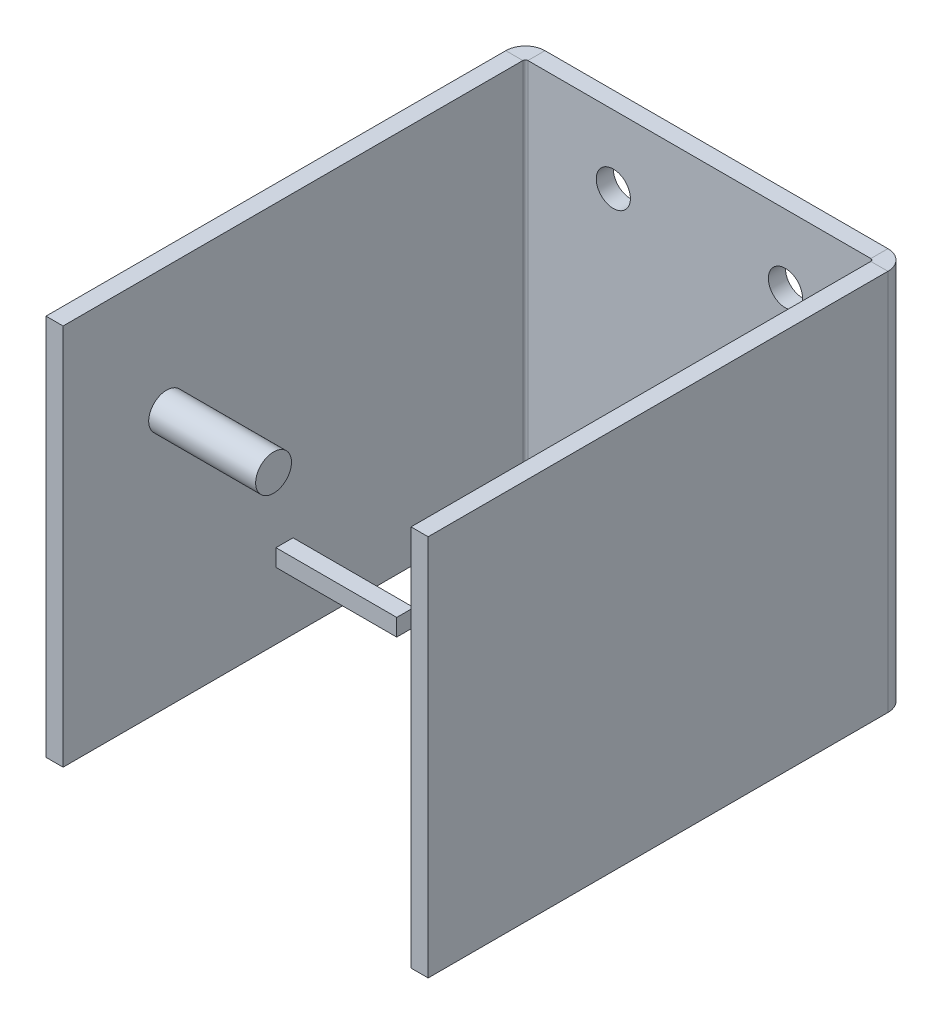
ISO-10303-21;
HEADER;
FILE_DESCRIPTION(('STEP AP214'),'2;1');
FILE_NAME('part.step','',(''),(''),'','','');
FILE_SCHEMA(('AUTOMOTIVE_DESIGN { 1 0 10303 214 1 1 1 1 }'));
ENDSEC;
DATA;
#1=APPLICATION_CONTEXT('core data for automotive mechanical design processes');
#2=APPLICATION_PROTOCOL_DEFINITION('international standard','automotive_design',2000,#1);
#3=PRODUCT_CONTEXT('',#1,'mechanical');
#4=PRODUCT('Part','Part','',(#3));
#5=PRODUCT_RELATED_PRODUCT_CATEGORY('part','',(#4));
#6=PRODUCT_DEFINITION_FORMATION('','',#4);
#7=PRODUCT_DEFINITION_CONTEXT('part definition',#1,'design');
#8=PRODUCT_DEFINITION('design','',#6,#7);
#9=PRODUCT_DEFINITION_SHAPE('','',#8);
#10=(LENGTH_UNIT() NAMED_UNIT(*) SI_UNIT(.MILLI.,.METRE.));
#11=(NAMED_UNIT(*) PLANE_ANGLE_UNIT() SI_UNIT($,.RADIAN.));
#12=(NAMED_UNIT(*) SI_UNIT($,.STERADIAN.) SOLID_ANGLE_UNIT());
#13=UNCERTAINTY_MEASURE_WITH_UNIT(LENGTH_MEASURE(1.E-05),#10,'distance_accuracy_value','');
#14=(GEOMETRIC_REPRESENTATION_CONTEXT(3) GLOBAL_UNCERTAINTY_ASSIGNED_CONTEXT((#13)) GLOBAL_UNIT_ASSIGNED_CONTEXT((#10,
#11,#12)) REPRESENTATION_CONTEXT('',''));
#15=CARTESIAN_POINT('',(0.,0.,0.));
#16=DIRECTION('',(0.,0.,1.));
#17=DIRECTION('',(1.,0.,0.));
#18=AXIS2_PLACEMENT_3D('',#15,#16,#17);
#19=CARTESIAN_POINT('',(106.84,0.,-3.90036222312842E-13));
#20=DIRECTION('',(-1.,0.,0.));
#21=DIRECTION('',(0.,0.,1.));
#22=AXIS2_PLACEMENT_3D('',#19,#20,#21);
#23=PLANE('',#22);
#24=DIRECTION('',(0.,0.,-1.));
#25=VECTOR('',#24,1.);
#26=CARTESIAN_POINT('',(106.84,111.84,135.298));
#27=LINE('',#26,#25);
#28=CARTESIAN_POINT('',(106.84,111.84,0.736600000000004));
#29=VERTEX_POINT('',#28);
#30=CARTESIAN_POINT('',(106.84,111.84,135.298));
#31=VERTEX_POINT('',#30);
#32=EDGE_CURVE('E353',#29,#31,#27,.F.);
#33=ORIENTED_EDGE('',*,*,#32,.F.);
#34=DIRECTION('',(0.,1.,0.));
#35=VECTOR('',#34,1.);
#36=CARTESIAN_POINT('',(106.84,0.,0.736600000000004));
#37=LINE('',#36,#35);
#38=CARTESIAN_POINT('',(106.84,0.,0.736600000000004));
#39=VERTEX_POINT('',#38);
#40=EDGE_CURVE('E360',#39,#29,#37,.T.);
#41=ORIENTED_EDGE('',*,*,#40,.F.);
#42=DIRECTION('',(0.,0.,1.));
#43=VECTOR('',#42,1.);
#44=CARTESIAN_POINT('',(106.84,0.,0.));
#45=LINE('',#44,#43);
#46=CARTESIAN_POINT('',(106.84,0.,135.298));
#47=VERTEX_POINT('',#46);
#48=EDGE_CURVE('E348',#47,#39,#45,.F.);
#49=ORIENTED_EDGE('',*,*,#48,.F.);
#50=DIRECTION('',(0.,1.,0.));
#51=VECTOR('',#50,1.);
#52=CARTESIAN_POINT('',(106.84,0.,135.298));
#53=LINE('',#52,#51);
#54=EDGE_CURVE('E351',#31,#47,#53,.F.);
#55=ORIENTED_EDGE('',*,*,#54,.F.);
#56=EDGE_LOOP('',(#33,#41,#49,#55));
#57=FACE_BOUND('',#56,.T.);
#58=DIRECTION('',(0.,0.,-1.));
#59=VECTOR('',#58,1.);
#60=CARTESIAN_POINT('',(106.84,24.5,72.9999999999996));
#61=LINE('',#60,#59);
#62=CARTESIAN_POINT('',(106.84,24.5,72.9999999999996));
#63=VERTEX_POINT('',#62);
#64=CARTESIAN_POINT('',(106.84,24.5,67.9999999999996));
#65=VERTEX_POINT('',#64);
#66=EDGE_CURVE('E284',#63,#65,#61,.T.);
#67=ORIENTED_EDGE('',*,*,#66,.F.);
#68=DIRECTION('',(0.,1.,0.));
#69=VECTOR('',#68,1.);
#70=CARTESIAN_POINT('',(106.84,19.5,72.9999999999996));
#71=LINE('',#70,#69);
#72=CARTESIAN_POINT('',(106.84,19.5,72.9999999999996));
#73=VERTEX_POINT('',#72);
#74=EDGE_CURVE('E278',#73,#63,#71,.T.);
#75=ORIENTED_EDGE('',*,*,#74,.F.);
#76=DIRECTION('',(0.,0.,1.));
#77=VECTOR('',#76,1.);
#78=CARTESIAN_POINT('',(106.84,19.5,67.9999999999996));
#79=LINE('',#78,#77);
#80=CARTESIAN_POINT('',(106.84,19.5,67.9999999999996));
#81=VERTEX_POINT('',#80);
#82=EDGE_CURVE('E243',#81,#73,#79,.T.);
#83=ORIENTED_EDGE('',*,*,#82,.F.);
#84=DIRECTION('',(0.,-1.,0.));
#85=VECTOR('',#84,1.);
#86=CARTESIAN_POINT('',(106.84,24.5,67.9999999999996));
#87=LINE('',#86,#85);
#88=EDGE_CURVE('E286',#65,#81,#87,.T.);
#89=ORIENTED_EDGE('',*,*,#88,.F.);
#90=EDGE_LOOP('',(#67,#75,#83,#89));
#91=FACE_BOUND('',#90,.T.);
#92=ADVANCED_FACE('F85',(#57,#91),#23,.T.);
#93=CARTESIAN_POINT('',(5.,0.,0.));
#94=DIRECTION('',(1.,0.,0.));
#95=DIRECTION('',(0.,0.,-1.));
#96=AXIS2_PLACEMENT_3D('',#93,#94,#95);
#97=PLANE('',#96);
#98=CARTESIAN_POINT('',(4.99999999999963,75.186,105.));
#99=DIRECTION('',(1.,0.,0.));
#100=DIRECTION('',(0.,0.,-1.));
#101=AXIS2_PLACEMENT_3D('',#98,#99,#100);
#102=CIRCLE('',#101,5.2455);
#103=CARTESIAN_POINT('',(4.99999999999965,75.186,99.7545));
#104=VERTEX_POINT('',#103);
#105=EDGE_CURVE('E269',#104,#104,#102,.T.);
#106=ORIENTED_EDGE('',*,*,#105,.F.);
#107=EDGE_LOOP('',(#106));
#108=FACE_BOUND('',#107,.T.);
#109=DIRECTION('',(0.,0.,-1.));
#110=VECTOR('',#109,1.);
#111=CARTESIAN_POINT('',(4.99999999999953,0.,135.298));
#112=LINE('',#111,#110);
#113=CARTESIAN_POINT('',(5.,0.,0.736599999999997));
#114=VERTEX_POINT('',#113);
#115=CARTESIAN_POINT('',(4.99999999999953,0.,135.298));
#116=VERTEX_POINT('',#115);
#117=EDGE_CURVE('E406',#114,#116,#112,.F.);
#118=ORIENTED_EDGE('',*,*,#117,.F.);
#119=DIRECTION('',(0.,-1.,0.));
#120=VECTOR('',#119,1.);
#121=CARTESIAN_POINT('',(5.,111.84,0.736599999999997));
#122=LINE('',#121,#120);
#123=CARTESIAN_POINT('',(5.,111.84,0.736599999999997));
#124=VERTEX_POINT('',#123);
#125=EDGE_CURVE('E413',#124,#114,#122,.T.);
#126=ORIENTED_EDGE('',*,*,#125,.F.);
#127=DIRECTION('',(0.,0.,1.));
#128=VECTOR('',#127,1.);
#129=CARTESIAN_POINT('',(5.,111.84,0.));
#130=LINE('',#129,#128);
#131=CARTESIAN_POINT('',(4.99999999999953,111.84,135.298));
#132=VERTEX_POINT('',#131);
#133=EDGE_CURVE('E401',#132,#124,#130,.F.);
#134=ORIENTED_EDGE('',*,*,#133,.F.);
#135=DIRECTION('',(0.,-1.,0.));
#136=VECTOR('',#135,1.);
#137=CARTESIAN_POINT('',(4.99999999999953,111.84,135.298));
#138=LINE('',#137,#136);
#139=EDGE_CURVE('E404',#116,#132,#138,.F.);
#140=ORIENTED_EDGE('',*,*,#139,.F.);
#141=EDGE_LOOP('',(#118,#126,#134,#140));
#142=FACE_BOUND('',#141,.T.);
#143=DIRECTION('',(0.,0.,-1.));
#144=VECTOR('',#143,1.);
#145=CARTESIAN_POINT('',(4.99999999999975,19.5,73.));
#146=LINE('',#145,#144);
#147=CARTESIAN_POINT('',(4.99999999999975,19.5,73.));
#148=VERTEX_POINT('',#147);
#149=CARTESIAN_POINT('',(4.99999999999976,19.5,68.));
#150=VERTEX_POINT('',#149);
#151=EDGE_CURVE('E308',#148,#150,#146,.T.);
#152=ORIENTED_EDGE('',*,*,#151,.F.);
#153=DIRECTION('',(0.,-1.,0.));
#154=VECTOR('',#153,1.);
#155=CARTESIAN_POINT('',(4.99999999999975,24.5,73.));
#156=LINE('',#155,#154);
#157=CARTESIAN_POINT('',(4.99999999999975,24.5,73.));
#158=VERTEX_POINT('',#157);
#159=EDGE_CURVE('E294',#158,#148,#156,.T.);
#160=ORIENTED_EDGE('',*,*,#159,.F.);
#161=DIRECTION('',(0.,0.,1.));
#162=VECTOR('',#161,1.);
#163=CARTESIAN_POINT('',(4.99999999999975,24.5,73.));
#164=LINE('',#163,#162);
#165=CARTESIAN_POINT('',(4.99999999999976,24.5,68.));
#166=VERTEX_POINT('',#165);
#167=EDGE_CURVE('E299',#166,#158,#164,.T.);
#168=ORIENTED_EDGE('',*,*,#167,.F.);
#169=DIRECTION('',(0.,1.,0.));
#170=VECTOR('',#169,1.);
#171=CARTESIAN_POINT('',(4.99999999999976,24.5,68.));
#172=LINE('',#171,#170);
#173=EDGE_CURVE('E310',#150,#166,#172,.T.);
#174=ORIENTED_EDGE('',*,*,#173,.F.);
#175=EDGE_LOOP('',(#152,#160,#168,#174));
#176=FACE_BOUND('',#175,.T.);
#177=ADVANCED_FACE('F480',(#108,#142,#176),#97,.T.);
#178=CARTESIAN_POINT('',(0.,0.,-5.));
#179=DIRECTION('',(0.,0.,-1.));
#180=DIRECTION('',(-1.,0.,0.));
#181=AXIS2_PLACEMENT_3D('',#178,#179,#180);
#182=PLANE('',#181);
#183=CARTESIAN_POINT('',(30.7366,91.84,-5.));
#184=DIRECTION('',(0.,0.,1.));
#185=DIRECTION('',(1.,0.,0.));
#186=AXIS2_PLACEMENT_3D('',#183,#184,#185);
#187=CIRCLE('',#186,5.);
#188=CARTESIAN_POINT('',(35.7366,91.84,-5.));
#189=VERTEX_POINT('',#188);
#190=EDGE_CURVE('E322',#189,#189,#187,.T.);
#191=ORIENTED_EDGE('',*,*,#190,.T.);
#192=EDGE_LOOP('',(#191));
#193=FACE_BOUND('',#192,.T.);
#194=CARTESIAN_POINT('',(81.1034,91.8399999999999,-5.));
#195=DIRECTION('',(0.,0.,1.));
#196=DIRECTION('',(-1.,0.,0.));
#197=AXIS2_PLACEMENT_3D('',#194,#195,#196);
#198=CIRCLE('',#197,5.00000000000001);
#199=CARTESIAN_POINT('',(76.1034,91.8399999999999,-5.));
#200=VERTEX_POINT('',#199);
#201=EDGE_CURVE('E321',#200,#200,#198,.T.);
#202=ORIENTED_EDGE('',*,*,#201,.T.);
#203=EDGE_LOOP('',(#202));
#204=FACE_BOUND('',#203,.T.);
#205=DIRECTION('',(-1.,0.,0.));
#206=VECTOR('',#205,1.);
#207=CARTESIAN_POINT('',(0.,111.84,-5.));
#208=LINE('',#207,#206);
#209=CARTESIAN_POINT('',(106.1034,111.84,-5.));
#210=VERTEX_POINT('',#209);
#211=CARTESIAN_POINT('',(5.7366,111.84,-5.));
#212=VERTEX_POINT('',#211);
#213=EDGE_CURVE('E13',#210,#212,#208,.T.);
#214=ORIENTED_EDGE('',*,*,#213,.F.);
#215=DIRECTION('',(0.,1.,0.));
#216=VECTOR('',#215,1.);
#217=CARTESIAN_POINT('',(106.1034,111.84,-5.));
#218=LINE('',#217,#216);
#219=CARTESIAN_POINT('',(106.1034,0.,-5.));
#220=VERTEX_POINT('',#219);
#221=EDGE_CURVE('E364',#210,#220,#218,.F.);
#222=ORIENTED_EDGE('',*,*,#221,.T.);
#223=DIRECTION('',(1.,0.,0.));
#224=VECTOR('',#223,1.);
#225=CARTESIAN_POINT('',(0.,0.,-5.));
#226=LINE('',#225,#224);
#227=CARTESIAN_POINT('',(5.7366,0.,-5.));
#228=VERTEX_POINT('',#227);
#229=EDGE_CURVE('E94',#228,#220,#226,.T.);
#230=ORIENTED_EDGE('',*,*,#229,.F.);
#231=DIRECTION('',(0.,-1.,0.));
#232=VECTOR('',#231,1.);
#233=CARTESIAN_POINT('',(5.7366,0.,-5.));
#234=LINE('',#233,#232);
#235=EDGE_CURVE('E417',#228,#212,#234,.F.);
#236=ORIENTED_EDGE('',*,*,#235,.T.);
#237=EDGE_LOOP('',(#214,#222,#230,#236));
#238=FACE_BOUND('',#237,.T.);
#239=ADVANCED_FACE('F503',(#193,#204,#238),#182,.T.);
#240=CARTESIAN_POINT('',(0.,0.,0.));
#241=DIRECTION('',(0.,0.,-1.));
#242=DIRECTION('',(-1.,0.,0.));
#243=AXIS2_PLACEMENT_3D('',#240,#241,#242);
#244=PLANE('',#243);
#245=CARTESIAN_POINT('',(30.7366,91.84,0.));
#246=DIRECTION('',(0.,0.,1.));
#247=DIRECTION('',(1.,0.,0.));
#248=AXIS2_PLACEMENT_3D('',#245,#246,#247);
#249=CIRCLE('',#248,5.);
#250=CARTESIAN_POINT('',(35.7366,91.84,0.));
#251=VERTEX_POINT('',#250);
#252=EDGE_CURVE('E326',#251,#251,#249,.T.);
#253=ORIENTED_EDGE('',*,*,#252,.F.);
#254=EDGE_LOOP('',(#253));
#255=FACE_BOUND('',#254,.T.);
#256=CARTESIAN_POINT('',(81.1034,91.8399999999999,0.));
#257=DIRECTION('',(0.,0.,1.));
#258=DIRECTION('',(-1.,0.,0.));
#259=AXIS2_PLACEMENT_3D('',#256,#257,#258);
#260=CIRCLE('',#259,5.00000000000001);
#261=CARTESIAN_POINT('',(76.1034,91.8399999999999,0.));
#262=VERTEX_POINT('',#261);
#263=EDGE_CURVE('E329',#262,#262,#260,.T.);
#264=ORIENTED_EDGE('',*,*,#263,.F.);
#265=EDGE_LOOP('',(#264));
#266=FACE_BOUND('',#265,.T.);
#267=DIRECTION('',(0.,1.,0.));
#268=VECTOR('',#267,1.);
#269=CARTESIAN_POINT('',(106.1034,111.84,0.));
#270=LINE('',#269,#268);
#271=CARTESIAN_POINT('',(106.1034,111.84,0.));
#272=VERTEX_POINT('',#271);
#273=CARTESIAN_POINT('',(106.1034,0.,0.));
#274=VERTEX_POINT('',#273);
#275=EDGE_CURVE('E377',#272,#274,#270,.F.);
#276=ORIENTED_EDGE('',*,*,#275,.F.);
#277=DIRECTION('',(-1.,0.,0.));
#278=VECTOR('',#277,1.);
#279=CARTESIAN_POINT('',(0.,111.84,0.));
#280=LINE('',#279,#278);
#281=CARTESIAN_POINT('',(5.7366,111.84,0.));
#282=VERTEX_POINT('',#281);
#283=EDGE_CURVE('E89',#272,#282,#280,.T.);
#284=ORIENTED_EDGE('',*,*,#283,.T.);
#285=DIRECTION('',(0.,-1.,0.));
#286=VECTOR('',#285,1.);
#287=CARTESIAN_POINT('',(5.7366,0.,0.));
#288=LINE('',#287,#286);
#289=CARTESIAN_POINT('',(5.7366,0.,0.));
#290=VERTEX_POINT('',#289);
#291=EDGE_CURVE('E430',#290,#282,#288,.F.);
#292=ORIENTED_EDGE('',*,*,#291,.F.);
#293=DIRECTION('',(1.,0.,0.));
#294=VECTOR('',#293,1.);
#295=CARTESIAN_POINT('',(0.,0.,0.));
#296=LINE('',#295,#294);
#297=EDGE_CURVE('E438',#290,#274,#296,.T.);
#298=ORIENTED_EDGE('',*,*,#297,.T.);
#299=EDGE_LOOP('',(#276,#284,#292,#298));
#300=FACE_BOUND('',#299,.T.);
#301=ADVANCED_FACE('F448',(#255,#266,#300),#244,.F.);
#302=CARTESIAN_POINT('',(0.,111.84,-5.));
#303=DIRECTION('',(0.,1.,0.));
#304=DIRECTION('',(0.,0.,1.));
#305=AXIS2_PLACEMENT_3D('',#302,#303,#304);
#306=PLANE('',#305);
#307=ORIENTED_EDGE('',*,*,#283,.F.);
#308=DIRECTION('',(0.,0.,-1.));
#309=VECTOR('',#308,1.);
#310=CARTESIAN_POINT('',(106.1034,111.84,0.));
#311=LINE('',#310,#309);
#312=EDGE_CURVE('E371',#272,#210,#311,.T.);
#313=ORIENTED_EDGE('',*,*,#312,.T.);
#314=ORIENTED_EDGE('',*,*,#213,.T.);
#315=DIRECTION('',(0.,0.,-1.));
#316=VECTOR('',#315,1.);
#317=CARTESIAN_POINT('',(5.7366,111.84,0.));
#318=LINE('',#317,#316);
#319=EDGE_CURVE('E435',#282,#212,#318,.T.);
#320=ORIENTED_EDGE('',*,*,#319,.F.);
#321=EDGE_LOOP('',(#307,#313,#314,#320));
#322=FACE_BOUND('',#321,.T.);
#323=ADVANCED_FACE('F458',(#322),#306,.T.);
#324=CARTESIAN_POINT('',(0.,0.,-5.));
#325=DIRECTION('',(0.,-1.,0.));
#326=DIRECTION('',(0.,0.,-1.));
#327=AXIS2_PLACEMENT_3D('',#324,#325,#326);
#328=PLANE('',#327);
#329=DIRECTION('',(0.,0.,-1.));
#330=VECTOR('',#329,1.);
#331=CARTESIAN_POINT('',(106.1034,0.,0.));
#332=LINE('',#331,#330);
#333=EDGE_CURVE('E381',#274,#220,#332,.T.);
#334=ORIENTED_EDGE('',*,*,#333,.F.);
#335=ORIENTED_EDGE('',*,*,#297,.F.);
#336=DIRECTION('',(0.,0.,-1.));
#337=VECTOR('',#336,1.);
#338=CARTESIAN_POINT('',(5.7366,0.,0.));
#339=LINE('',#338,#337);
#340=EDGE_CURVE('E424',#290,#228,#339,.T.);
#341=ORIENTED_EDGE('',*,*,#340,.T.);
#342=ORIENTED_EDGE('',*,*,#229,.T.);
#343=EDGE_LOOP('',(#334,#335,#341,#342));
#344=FACE_BOUND('',#343,.T.);
#345=ADVANCED_FACE('F87',(#344),#328,.T.);
#346=CARTESIAN_POINT('',(5.7366,111.84,0.7366));
#347=DIRECTION('',(0.,1.,0.));
#348=DIRECTION('',(0.,0.,1.));
#349=AXIS2_PLACEMENT_3D('',#346,#347,#348);
#350=PLANE('',#349);
#351=DIRECTION('',(1.,0.,0.));
#352=VECTOR('',#351,1.);
#353=CARTESIAN_POINT('',(0.,111.84,0.73659999999998));
#354=LINE('',#353,#352);
#355=CARTESIAN_POINT('',(0.,111.84,0.73659999999998));
#356=VERTEX_POINT('',#355);
#357=EDGE_CURVE('E384',#124,#356,#354,.F.);
#358=ORIENTED_EDGE('',*,*,#357,.F.);
#359=CARTESIAN_POINT('',(5.7366,111.84,0.7366));
#360=DIRECTION('',(0.,-1.,0.));
#361=DIRECTION('',(0.,0.,-1.));
#362=AXIS2_PLACEMENT_3D('',#359,#360,#361);
#363=CIRCLE('',#362,0.7366);
#364=EDGE_CURVE('E427',#282,#124,#363,.F.);
#365=ORIENTED_EDGE('',*,*,#364,.F.);
#366=ORIENTED_EDGE('',*,*,#319,.T.);
#367=CARTESIAN_POINT('',(5.7366,111.84,0.7366));
#368=DIRECTION('',(0.,-1.,0.));
#369=DIRECTION('',(0.,0.,-1.));
#370=AXIS2_PLACEMENT_3D('',#367,#368,#369);
#371=CIRCLE('',#370,5.7366);
#372=EDGE_CURVE('E420',#212,#356,#371,.F.);
#373=ORIENTED_EDGE('',*,*,#372,.T.);
#374=EDGE_LOOP('',(#358,#365,#366,#373));
#375=FACE_BOUND('',#374,.T.);
#376=ADVANCED_FACE('F457',(#375),#350,.T.);
#377=CARTESIAN_POINT('',(5.7366,0.,0.7366));
#378=DIRECTION('',(0.,1.,0.));
#379=DIRECTION('',(0.,0.,1.));
#380=AXIS2_PLACEMENT_3D('',#377,#378,#379);
#381=PLANE('',#380);
#382=CARTESIAN_POINT('',(5.7366,0.,0.7366));
#383=DIRECTION('',(0.,-1.,0.));
#384=DIRECTION('',(0.,0.,-1.));
#385=AXIS2_PLACEMENT_3D('',#382,#383,#384);
#386=CIRCLE('',#385,0.7366);
#387=EDGE_CURVE('E390',#114,#290,#386,.T.);
#388=ORIENTED_EDGE('',*,*,#387,.F.);
#389=DIRECTION('',(1.,0.,0.));
#390=VECTOR('',#389,1.);
#391=CARTESIAN_POINT('',(5.,0.,0.736599999999997));
#392=LINE('',#391,#390);
#393=CARTESIAN_POINT('',(0.,0.,0.73659999999998));
#394=VERTEX_POINT('',#393);
#395=EDGE_CURVE('E410',#114,#394,#392,.F.);
#396=ORIENTED_EDGE('',*,*,#395,.T.);
#397=CARTESIAN_POINT('',(5.7366,0.,0.7366));
#398=DIRECTION('',(0.,-1.,0.));
#399=DIRECTION('',(0.,0.,-1.));
#400=AXIS2_PLACEMENT_3D('',#397,#398,#399);
#401=CIRCLE('',#400,5.7366);
#402=EDGE_CURVE('E421',#394,#228,#401,.T.);
#403=ORIENTED_EDGE('',*,*,#402,.T.);
#404=ORIENTED_EDGE('',*,*,#340,.F.);
#405=EDGE_LOOP('',(#388,#396,#403,#404));
#406=FACE_BOUND('',#405,.T.);
#407=ADVANCED_FACE('F484',(#406),#381,.F.);
#408=CARTESIAN_POINT('',(5.7366,0.,0.7366));
#409=DIRECTION('',(0.,-1.,0.));
#410=DIRECTION('',(-1.,0.,0.));
#411=AXIS2_PLACEMENT_3D('',#408,#409,#410);
#412=CYLINDRICAL_SURFACE('',#411,5.7366);
#413=ORIENTED_EDGE('',*,*,#235,.F.);
#414=ORIENTED_EDGE('',*,*,#402,.F.);
#415=DIRECTION('',(0.,-1.,0.));
#416=VECTOR('',#415,1.);
#417=CARTESIAN_POINT('',(0.,111.84,0.73659999999998));
#418=LINE('',#417,#416);
#419=EDGE_CURVE('E408',#394,#356,#418,.F.);
#420=ORIENTED_EDGE('',*,*,#419,.T.);
#421=ORIENTED_EDGE('',*,*,#372,.F.);
#422=EDGE_LOOP('',(#413,#414,#420,#421));
#423=FACE_BOUND('',#422,.T.);
#424=ADVANCED_FACE('F463',(#423),#412,.T.);
#425=CARTESIAN_POINT('',(5.7366,0.,0.7366));
#426=DIRECTION('',(0.,-1.,0.));
#427=DIRECTION('',(-1.,0.,0.));
#428=AXIS2_PLACEMENT_3D('',#425,#426,#427);
#429=CYLINDRICAL_SURFACE('',#428,0.7366);
#430=ORIENTED_EDGE('',*,*,#291,.T.);
#431=ORIENTED_EDGE('',*,*,#364,.T.);
#432=ORIENTED_EDGE('',*,*,#125,.T.);
#433=ORIENTED_EDGE('',*,*,#387,.T.);
#434=EDGE_LOOP('',(#430,#431,#432,#433));
#435=FACE_BOUND('',#434,.T.);
#436=ADVANCED_FACE('F453',(#435),#429,.F.);
#437=CARTESIAN_POINT('',(-4.7271214720368E-13,0.,135.298));
#438=DIRECTION('',(0.,1.,0.));
#439=DIRECTION('',(0.,0.,1.));
#440=AXIS2_PLACEMENT_3D('',#437,#438,#439);
#441=PLANE('',#440);
#442=ORIENTED_EDGE('',*,*,#395,.F.);
#443=ORIENTED_EDGE('',*,*,#117,.T.);
#444=DIRECTION('',(1.,0.,0.));
#445=VECTOR('',#444,1.);
#446=CARTESIAN_POINT('',(-4.7271214720368E-13,0.,135.298));
#447=LINE('',#446,#445);
#448=CARTESIAN_POINT('',(-4.72390442182798E-13,0.,135.298));
#449=VERTEX_POINT('',#448);
#450=EDGE_CURVE('E387',#449,#116,#447,.T.);
#451=ORIENTED_EDGE('',*,*,#450,.F.);
#452=DIRECTION('',(0.,0.,1.));
#453=VECTOR('',#452,1.);
#454=CARTESIAN_POINT('',(0.,0.,0.));
#455=LINE('',#454,#453);
#456=EDGE_CURVE('E399',#394,#449,#455,.T.);
#457=ORIENTED_EDGE('',*,*,#456,.F.);
#458=EDGE_LOOP('',(#442,#443,#451,#457));
#459=FACE_BOUND('',#458,.T.);
#460=ADVANCED_FACE('F486',(#459),#441,.F.);
#461=CARTESIAN_POINT('',(0.,111.84,0.));
#462=DIRECTION('',(0.,-1.,0.));
#463=DIRECTION('',(0.,0.,-1.));
#464=AXIS2_PLACEMENT_3D('',#461,#462,#463);
#465=PLANE('',#464);
#466=ORIENTED_EDGE('',*,*,#357,.T.);
#467=DIRECTION('',(0.,0.,-1.));
#468=VECTOR('',#467,1.);
#469=CARTESIAN_POINT('',(0.,111.84,0.));
#470=LINE('',#469,#468);
#471=CARTESIAN_POINT('',(-4.72390442182798E-13,111.84,135.298));
#472=VERTEX_POINT('',#471);
#473=EDGE_CURVE('E394',#472,#356,#470,.T.);
#474=ORIENTED_EDGE('',*,*,#473,.F.);
#475=DIRECTION('',(1.,0.,0.));
#476=VECTOR('',#475,1.);
#477=CARTESIAN_POINT('',(-4.72390442182798E-13,111.84,135.298));
#478=LINE('',#477,#476);
#479=EDGE_CURVE('E391',#472,#132,#478,.T.);
#480=ORIENTED_EDGE('',*,*,#479,.T.);
#481=ORIENTED_EDGE('',*,*,#133,.T.);
#482=EDGE_LOOP('',(#466,#474,#480,#481));
#483=FACE_BOUND('',#482,.T.);
#484=ADVANCED_FACE('F467',(#483),#465,.F.);
#485=CARTESIAN_POINT('',(0.,0.,0.));
#486=DIRECTION('',(1.,0.,0.));
#487=DIRECTION('',(0.,0.,-1.));
#488=AXIS2_PLACEMENT_3D('',#485,#486,#487);
#489=PLANE('',#488);
#490=ORIENTED_EDGE('',*,*,#419,.F.);
#491=ORIENTED_EDGE('',*,*,#456,.T.);
#492=DIRECTION('',(0.,1.,0.));
#493=VECTOR('',#492,1.);
#494=CARTESIAN_POINT('',(-4.72390442182798E-13,0.,135.298));
#495=LINE('',#494,#493);
#496=EDGE_CURVE('E397',#449,#472,#495,.T.);
#497=ORIENTED_EDGE('',*,*,#496,.T.);
#498=ORIENTED_EDGE('',*,*,#473,.T.);
#499=EDGE_LOOP('',(#490,#491,#497,#498));
#500=FACE_BOUND('',#499,.T.);
#501=ADVANCED_FACE('F470',(#500),#489,.F.);
#502=CARTESIAN_POINT('',(-4.7271214720368E-13,111.84,135.298));
#503=DIRECTION('',(0.,0.,-1.));
#504=DIRECTION('',(-1.,0.,0.));
#505=AXIS2_PLACEMENT_3D('',#502,#503,#504);
#506=PLANE('',#505);
#507=ORIENTED_EDGE('',*,*,#139,.T.);
#508=ORIENTED_EDGE('',*,*,#479,.F.);
#509=ORIENTED_EDGE('',*,*,#496,.F.);
#510=ORIENTED_EDGE('',*,*,#450,.T.);
#511=EDGE_LOOP('',(#507,#508,#509,#510));
#512=FACE_BOUND('',#511,.T.);
#513=ADVANCED_FACE('F476',(#512),#506,.F.);
#514=CARTESIAN_POINT('',(106.1034,0.,0.736600000000006));
#515=DIRECTION('',(0.,-1.,0.));
#516=DIRECTION('',(0.,0.,-1.));
#517=AXIS2_PLACEMENT_3D('',#514,#515,#516);
#518=PLANE('',#517);
#519=DIRECTION('',(-1.,0.,0.));
#520=VECTOR('',#519,1.);
#521=CARTESIAN_POINT('',(111.84,0.,0.736599999999986));
#522=LINE('',#521,#520);
#523=CARTESIAN_POINT('',(111.84,0.,0.736599999999986));
#524=VERTEX_POINT('',#523);
#525=EDGE_CURVE('E325',#39,#524,#522,.F.);
#526=ORIENTED_EDGE('',*,*,#525,.F.);
#527=CARTESIAN_POINT('',(106.1034,0.,0.736600000000006));
#528=DIRECTION('',(0.,1.,0.));
#529=DIRECTION('',(0.,0.,1.));
#530=AXIS2_PLACEMENT_3D('',#527,#528,#529);
#531=CIRCLE('',#530,0.736600000000004);
#532=EDGE_CURVE('E374',#274,#39,#531,.F.);
#533=ORIENTED_EDGE('',*,*,#532,.F.);
#534=ORIENTED_EDGE('',*,*,#333,.T.);
#535=CARTESIAN_POINT('',(106.1034,0.,0.736600000000006));
#536=DIRECTION('',(0.,1.,0.));
#537=DIRECTION('',(0.,0.,1.));
#538=AXIS2_PLACEMENT_3D('',#535,#536,#537);
#539=CIRCLE('',#538,5.7366);
#540=EDGE_CURVE('E367',#220,#524,#539,.F.);
#541=ORIENTED_EDGE('',*,*,#540,.T.);
#542=EDGE_LOOP('',(#526,#533,#534,#541));
#543=FACE_BOUND('',#542,.T.);
#544=ADVANCED_FACE('F534',(#543),#518,.T.);
#545=CARTESIAN_POINT('',(106.1034,111.84,0.736600000000006));
#546=DIRECTION('',(0.,-1.,0.));
#547=DIRECTION('',(0.,0.,-1.));
#548=AXIS2_PLACEMENT_3D('',#545,#546,#547);
#549=PLANE('',#548);
#550=CARTESIAN_POINT('',(106.1034,111.84,0.736600000000006));
#551=DIRECTION('',(0.,1.,0.));
#552=DIRECTION('',(0.,0.,1.));
#553=AXIS2_PLACEMENT_3D('',#550,#551,#552);
#554=CIRCLE('',#553,0.736600000000004);
#555=EDGE_CURVE('E337',#29,#272,#554,.T.);
#556=ORIENTED_EDGE('',*,*,#555,.F.);
#557=DIRECTION('',(-1.,0.,0.));
#558=VECTOR('',#557,1.);
#559=CARTESIAN_POINT('',(106.84,111.84,0.736600000000004));
#560=LINE('',#559,#558);
#561=CARTESIAN_POINT('',(111.84,111.84,0.736599999999986));
#562=VERTEX_POINT('',#561);
#563=EDGE_CURVE('E357',#29,#562,#560,.F.);
#564=ORIENTED_EDGE('',*,*,#563,.T.);
#565=CARTESIAN_POINT('',(106.1034,111.84,0.736600000000006));
#566=DIRECTION('',(0.,1.,0.));
#567=DIRECTION('',(0.,0.,1.));
#568=AXIS2_PLACEMENT_3D('',#565,#566,#567);
#569=CIRCLE('',#568,5.7366);
#570=EDGE_CURVE('E368',#562,#210,#569,.T.);
#571=ORIENTED_EDGE('',*,*,#570,.T.);
#572=ORIENTED_EDGE('',*,*,#312,.F.);
#573=EDGE_LOOP('',(#556,#564,#571,#572));
#574=FACE_BOUND('',#573,.T.);
#575=ADVANCED_FACE('F529',(#574),#549,.F.);
#576=CARTESIAN_POINT('',(106.1034,111.84,0.736600000000006));
#577=DIRECTION('',(0.,1.,0.));
#578=DIRECTION('',(1.,0.,0.));
#579=AXIS2_PLACEMENT_3D('',#576,#577,#578);
#580=CYLINDRICAL_SURFACE('',#579,5.7366);
#581=ORIENTED_EDGE('',*,*,#221,.F.);
#582=ORIENTED_EDGE('',*,*,#570,.F.);
#583=DIRECTION('',(0.,1.,0.));
#584=VECTOR('',#583,1.);
#585=CARTESIAN_POINT('',(111.84,0.,0.736599999999986));
#586=LINE('',#585,#584);
#587=EDGE_CURVE('E355',#562,#524,#586,.F.);
#588=ORIENTED_EDGE('',*,*,#587,.T.);
#589=ORIENTED_EDGE('',*,*,#540,.F.);
#590=EDGE_LOOP('',(#581,#582,#588,#589));
#591=FACE_BOUND('',#590,.T.);
#592=ADVANCED_FACE('F526',(#591),#580,.T.);
#593=CARTESIAN_POINT('',(106.1034,111.84,0.736600000000006));
#594=DIRECTION('',(0.,1.,0.));
#595=DIRECTION('',(1.,0.,0.));
#596=AXIS2_PLACEMENT_3D('',#593,#594,#595);
#597=CYLINDRICAL_SURFACE('',#596,0.736600000000004);
#598=ORIENTED_EDGE('',*,*,#275,.T.);
#599=ORIENTED_EDGE('',*,*,#532,.T.);
#600=ORIENTED_EDGE('',*,*,#40,.T.);
#601=ORIENTED_EDGE('',*,*,#555,.T.);
#602=EDGE_LOOP('',(#598,#599,#600,#601));
#603=FACE_BOUND('',#602,.T.);
#604=ADVANCED_FACE('F524',(#603),#597,.F.);
#605=CARTESIAN_POINT('',(111.84,111.84,135.298));
#606=DIRECTION('',(0.,-1.,0.));
#607=DIRECTION('',(0.,0.,-1.));
#608=AXIS2_PLACEMENT_3D('',#605,#606,#607);
#609=PLANE('',#608);
#610=ORIENTED_EDGE('',*,*,#563,.F.);
#611=ORIENTED_EDGE('',*,*,#32,.T.);
#612=DIRECTION('',(-1.,0.,0.));
#613=VECTOR('',#612,1.);
#614=CARTESIAN_POINT('',(111.84,111.84,135.298));
#615=LINE('',#614,#613);
#616=CARTESIAN_POINT('',(111.84,111.84,135.298));
#617=VERTEX_POINT('',#616);
#618=EDGE_CURVE('E334',#617,#31,#615,.T.);
#619=ORIENTED_EDGE('',*,*,#618,.F.);
#620=DIRECTION('',(0.,0.,1.));
#621=VECTOR('',#620,1.);
#622=CARTESIAN_POINT('',(111.84,111.84,-4.07493629007058E-13));
#623=LINE('',#622,#621);
#624=EDGE_CURVE('E346',#562,#617,#623,.T.);
#625=ORIENTED_EDGE('',*,*,#624,.F.);
#626=EDGE_LOOP('',(#610,#611,#619,#625));
#627=FACE_BOUND('',#626,.T.);
#628=ADVANCED_FACE('F515',(#627),#609,.F.);
#629=CARTESIAN_POINT('',(111.84,0.,0.));
#630=DIRECTION('',(0.,1.,0.));
#631=DIRECTION('',(0.,0.,1.));
#632=AXIS2_PLACEMENT_3D('',#629,#630,#631);
#633=PLANE('',#632);
#634=ORIENTED_EDGE('',*,*,#525,.T.);
#635=DIRECTION('',(0.,0.,-1.));
#636=VECTOR('',#635,1.);
#637=CARTESIAN_POINT('',(111.84,0.,-4.07493629007058E-13));
#638=LINE('',#637,#636);
#639=CARTESIAN_POINT('',(111.84,0.,135.298));
#640=VERTEX_POINT('',#639);
#641=EDGE_CURVE('E341',#640,#524,#638,.T.);
#642=ORIENTED_EDGE('',*,*,#641,.F.);
#643=DIRECTION('',(-1.,0.,0.));
#644=VECTOR('',#643,1.);
#645=CARTESIAN_POINT('',(111.84,0.,135.298));
#646=LINE('',#645,#644);
#647=EDGE_CURVE('E338',#640,#47,#646,.T.);
#648=ORIENTED_EDGE('',*,*,#647,.T.);
#649=ORIENTED_EDGE('',*,*,#48,.T.);
#650=EDGE_LOOP('',(#634,#642,#648,#649));
#651=FACE_BOUND('',#650,.T.);
#652=ADVANCED_FACE('F512',(#651),#633,.F.);
#653=CARTESIAN_POINT('',(111.84,0.,-4.07493629007058E-13));
#654=DIRECTION('',(-1.,0.,0.));
#655=DIRECTION('',(0.,0.,1.));
#656=AXIS2_PLACEMENT_3D('',#653,#654,#655);
#657=PLANE('',#656);
#658=ORIENTED_EDGE('',*,*,#587,.F.);
#659=ORIENTED_EDGE('',*,*,#624,.T.);
#660=DIRECTION('',(0.,-1.,0.));
#661=VECTOR('',#660,1.);
#662=CARTESIAN_POINT('',(111.84,0.,135.298));
#663=LINE('',#662,#661);
#664=EDGE_CURVE('E344',#617,#640,#663,.T.);
#665=ORIENTED_EDGE('',*,*,#664,.T.);
#666=ORIENTED_EDGE('',*,*,#641,.T.);
#667=EDGE_LOOP('',(#658,#659,#665,#666));
#668=FACE_BOUND('',#667,.T.);
#669=ADVANCED_FACE('F510',(#668),#657,.F.);
#670=CARTESIAN_POINT('',(111.84,0.,135.298));
#671=DIRECTION('',(0.,0.,-1.));
#672=DIRECTION('',(-1.,0.,0.));
#673=AXIS2_PLACEMENT_3D('',#670,#671,#672);
#674=PLANE('',#673);
#675=ORIENTED_EDGE('',*,*,#54,.T.);
#676=ORIENTED_EDGE('',*,*,#647,.F.);
#677=ORIENTED_EDGE('',*,*,#664,.F.);
#678=ORIENTED_EDGE('',*,*,#618,.T.);
#679=EDGE_LOOP('',(#675,#676,#677,#678));
#680=FACE_BOUND('',#679,.T.);
#681=ADVANCED_FACE('F517',(#680),#674,.F.);
#682=CARTESIAN_POINT('',(81.1034,91.8399999999999,-5.));
#683=DIRECTION('',(0.,0.,1.));
#684=DIRECTION('',(1.,0.,0.));
#685=AXIS2_PLACEMENT_3D('',#682,#683,#684);
#686=CYLINDRICAL_SURFACE('',#685,5.00000000000001);
#687=ORIENTED_EDGE('',*,*,#201,.F.);
#688=EDGE_LOOP('',(#687));
#689=FACE_BOUND('',#688,.T.);
#690=ORIENTED_EDGE('',*,*,#263,.T.);
#691=EDGE_LOOP('',(#690));
#692=FACE_BOUND('',#691,.T.);
#693=ADVANCED_FACE('F520',(#689,#692),#686,.F.);
#694=CARTESIAN_POINT('',(30.7366,91.84,-5.));
#695=DIRECTION('',(0.,0.,1.));
#696=DIRECTION('',(1.,0.,0.));
#697=AXIS2_PLACEMENT_3D('',#694,#695,#696);
#698=CYLINDRICAL_SURFACE('',#697,5.);
#699=ORIENTED_EDGE('',*,*,#190,.F.);
#700=EDGE_LOOP('',(#699));
#701=FACE_BOUND('',#700,.T.);
#702=ORIENTED_EDGE('',*,*,#252,.T.);
#703=EDGE_LOOP('',(#702));
#704=FACE_BOUND('',#703,.T.);
#705=ADVANCED_FACE('F587',(#701,#704),#698,.F.);
#706=CARTESIAN_POINT('',(40.3419999999997,24.5,73.0000000000001));
#707=DIRECTION('',(0.,0.,-1.));
#708=DIRECTION('',(-1.,0.,0.));
#709=AXIS2_PLACEMENT_3D('',#706,#707,#708);
#710=PLANE('',#709);
#711=ORIENTED_EDGE('',*,*,#159,.T.);
#712=DIRECTION('',(-1.,0.,0.));
#713=VECTOR('',#712,1.);
#714=CARTESIAN_POINT('',(40.3419999999997,19.5,73.0000000000001));
#715=LINE('',#714,#713);
#716=CARTESIAN_POINT('',(40.3419999999997,19.5,73.0000000000001));
#717=VERTEX_POINT('',#716);
#718=EDGE_CURVE('E319',#717,#148,#715,.T.);
#719=ORIENTED_EDGE('',*,*,#718,.F.);
#720=DIRECTION('',(0.,-1.,0.));
#721=VECTOR('',#720,1.);
#722=CARTESIAN_POINT('',(40.3419999999997,24.5,73.0000000000001));
#723=LINE('',#722,#721);
#724=CARTESIAN_POINT('',(40.3419999999997,24.5,73.0000000000001));
#725=VERTEX_POINT('',#724);
#726=EDGE_CURVE('E295',#725,#717,#723,.T.);
#727=ORIENTED_EDGE('',*,*,#726,.F.);
#728=DIRECTION('',(-1.,0.,0.));
#729=VECTOR('',#728,1.);
#730=CARTESIAN_POINT('',(40.3419999999997,24.5,73.0000000000001));
#731=LINE('',#730,#729);
#732=EDGE_CURVE('E305',#725,#158,#731,.T.);
#733=ORIENTED_EDGE('',*,*,#732,.T.);
#734=EDGE_LOOP('',(#711,#719,#727,#733));
#735=FACE_BOUND('',#734,.T.);
#736=ADVANCED_FACE('F594',(#735),#710,.F.);
#737=CARTESIAN_POINT('',(40.3419999999997,19.5,73.0000000000001));
#738=DIRECTION('',(0.,1.,0.));
#739=DIRECTION('',(0.,0.,1.));
#740=AXIS2_PLACEMENT_3D('',#737,#738,#739);
#741=PLANE('',#740);
#742=ORIENTED_EDGE('',*,*,#151,.T.);
#743=DIRECTION('',(-1.,0.,0.));
#744=VECTOR('',#743,1.);
#745=CARTESIAN_POINT('',(40.3419999999998,19.5,68.0000000000001));
#746=LINE('',#745,#744);
#747=CARTESIAN_POINT('',(40.3419999999998,19.5,68.0000000000001));
#748=VERTEX_POINT('',#747);
#749=EDGE_CURVE('E316',#748,#150,#746,.T.);
#750=ORIENTED_EDGE('',*,*,#749,.F.);
#751=DIRECTION('',(0.,0.,-1.));
#752=VECTOR('',#751,1.);
#753=CARTESIAN_POINT('',(40.3419999999997,19.5,73.0000000000001));
#754=LINE('',#753,#752);
#755=EDGE_CURVE('E298',#717,#748,#754,.T.);
#756=ORIENTED_EDGE('',*,*,#755,.F.);
#757=ORIENTED_EDGE('',*,*,#718,.T.);
#758=EDGE_LOOP('',(#742,#750,#756,#757));
#759=FACE_BOUND('',#758,.T.);
#760=ADVANCED_FACE('F602',(#759),#741,.F.);
#761=CARTESIAN_POINT('',(40.3419999999998,24.5,68.0000000000001));
#762=DIRECTION('',(0.,0.,1.));
#763=DIRECTION('',(1.,0.,0.));
#764=AXIS2_PLACEMENT_3D('',#761,#762,#763);
#765=PLANE('',#764);
#766=ORIENTED_EDGE('',*,*,#173,.T.);
#767=DIRECTION('',(-1.,0.,0.));
#768=VECTOR('',#767,1.);
#769=CARTESIAN_POINT('',(40.3419999999998,24.5,68.0000000000001));
#770=LINE('',#769,#768);
#771=CARTESIAN_POINT('',(40.3419999999998,24.5,68.0000000000001));
#772=VERTEX_POINT('',#771);
#773=EDGE_CURVE('E110',#772,#166,#770,.T.);
#774=ORIENTED_EDGE('',*,*,#773,.F.);
#775=DIRECTION('',(0.,1.,0.));
#776=VECTOR('',#775,1.);
#777=CARTESIAN_POINT('',(40.3419999999998,24.5,68.0000000000001));
#778=LINE('',#777,#776);
#779=EDGE_CURVE('E301',#748,#772,#778,.T.);
#780=ORIENTED_EDGE('',*,*,#779,.F.);
#781=ORIENTED_EDGE('',*,*,#749,.T.);
#782=EDGE_LOOP('',(#766,#774,#780,#781));
#783=FACE_BOUND('',#782,.T.);
#784=ADVANCED_FACE('F610',(#783),#765,.F.);
#785=CARTESIAN_POINT('',(40.3419999999997,24.5,73.0000000000001));
#786=DIRECTION('',(0.,-1.,0.));
#787=DIRECTION('',(0.,0.,-1.));
#788=AXIS2_PLACEMENT_3D('',#785,#786,#787);
#789=PLANE('',#788);
#790=ORIENTED_EDGE('',*,*,#167,.T.);
#791=ORIENTED_EDGE('',*,*,#732,.F.);
#792=DIRECTION('',(0.,0.,1.));
#793=VECTOR('',#792,1.);
#794=CARTESIAN_POINT('',(40.3419999999997,24.5,73.0000000000001));
#795=LINE('',#794,#793);
#796=EDGE_CURVE('E303',#772,#725,#795,.T.);
#797=ORIENTED_EDGE('',*,*,#796,.F.);
#798=ORIENTED_EDGE('',*,*,#773,.T.);
#799=EDGE_LOOP('',(#790,#791,#797,#798));
#800=FACE_BOUND('',#799,.T.);
#801=ADVANCED_FACE('F618',(#800),#789,.F.);
#802=CARTESIAN_POINT('',(40.342,0.,1.40743168237162E-13));
#803=DIRECTION('',(1.,0.,0.));
#804=DIRECTION('',(0.,0.,-1.));
#805=AXIS2_PLACEMENT_3D('',#802,#803,#804);
#806=PLANE('',#805);
#807=ORIENTED_EDGE('',*,*,#726,.T.);
#808=ORIENTED_EDGE('',*,*,#755,.T.);
#809=ORIENTED_EDGE('',*,*,#779,.T.);
#810=ORIENTED_EDGE('',*,*,#796,.T.);
#811=EDGE_LOOP('',(#807,#808,#809,#810));
#812=FACE_BOUND('',#811,.T.);
#813=ADVANCED_FACE('F626',(#812),#806,.T.);
#814=CARTESIAN_POINT('',(70.3400000000003,19.5,72.9999999999998));
#815=DIRECTION('',(0.,0.,-1.));
#816=DIRECTION('',(-1.,0.,0.));
#817=AXIS2_PLACEMENT_3D('',#814,#815,#816);
#818=PLANE('',#817);
#819=ORIENTED_EDGE('',*,*,#74,.T.);
#820=DIRECTION('',(1.,0.,0.));
#821=VECTOR('',#820,1.);
#822=CARTESIAN_POINT('',(70.3400000000003,24.5,72.9999999999998));
#823=LINE('',#822,#821);
#824=CARTESIAN_POINT('',(68.2923395098934,24.5,73.0000000000001));
#825=VERTEX_POINT('',#824);
#826=EDGE_CURVE('E252',#825,#63,#823,.T.);
#827=ORIENTED_EDGE('',*,*,#826,.F.);
#828=DIRECTION('',(0.,1.,0.));
#829=VECTOR('',#828,1.);
#830=CARTESIAN_POINT('',(68.2923395098934,19.5,73.0000000000001));
#831=LINE('',#830,#829);
#832=CARTESIAN_POINT('',(68.2923395098934,19.5,73.0000000000001));
#833=VERTEX_POINT('',#832);
#834=EDGE_CURVE('E250',#833,#825,#831,.T.);
#835=ORIENTED_EDGE('',*,*,#834,.F.);
#836=DIRECTION('',(1.,0.,0.));
#837=VECTOR('',#836,1.);
#838=CARTESIAN_POINT('',(70.3400000000003,19.5,72.9999999999998));
#839=LINE('',#838,#837);
#840=EDGE_CURVE('E235',#833,#73,#839,.T.);
#841=ORIENTED_EDGE('',*,*,#840,.T.);
#842=EDGE_LOOP('',(#819,#827,#835,#841));
#843=FACE_BOUND('',#842,.T.);
#844=ADVANCED_FACE('F251',(#843),#818,.F.);
#845=CARTESIAN_POINT('',(70.3400000000003,24.5,72.9999999999998));
#846=DIRECTION('',(0.,-1.,0.));
#847=DIRECTION('',(0.,0.,-1.));
#848=AXIS2_PLACEMENT_3D('',#845,#846,#847);
#849=PLANE('',#848);
#850=DIRECTION('',(1.,0.,0.));
#851=VECTOR('',#850,1.);
#852=CARTESIAN_POINT('',(70.3400000000002,24.5,67.9999999999998));
#853=LINE('',#852,#851);
#854=CARTESIAN_POINT('',(70.3400000000002,24.5,67.9999999999997));
#855=VERTEX_POINT('',#854);
#856=EDGE_CURVE('E290',#855,#65,#853,.T.);
#857=ORIENTED_EDGE('',*,*,#856,.F.);
#858=CARTESIAN_POINT('',(57.8884940669815,24.5,70.4999999999998));
#859=DIRECTION('',(0.,1.,0.));
#860=DIRECTION('',(0.,0.,1.));
#861=AXIS2_PLACEMENT_3D('',#858,#859,#860);
#862=CIRCLE('',#861,12.7);
#863=CARTESIAN_POINT('',(45.4369881339629,24.5,73.0000000000001));
#864=VERTEX_POINT('',#863);
#865=EDGE_CURVE('E266',#855,#864,#862,.T.);
#866=ORIENTED_EDGE('',*,*,#865,.T.);
#867=DIRECTION('',(1.,0.,0.));
#868=VECTOR('',#867,1.);
#869=CARTESIAN_POINT('',(45.4369881339629,24.5,73.0000000000001));
#870=LINE('',#869,#868);
#871=CARTESIAN_POINT('',(47.4846486240696,24.5,73.0000000000001));
#872=VERTEX_POINT('',#871);
#873=EDGE_CURVE('E262',#864,#872,#870,.T.);
#874=ORIENTED_EDGE('',*,*,#873,.T.);
#875=CARTESIAN_POINT('',(57.8884940669815,24.5,70.4999999999998));
#876=DIRECTION('',(0.,-1.,0.));
#877=DIRECTION('',(0.,0.,1.));
#878=AXIS2_PLACEMENT_3D('',#875,#876,#877);
#879=CIRCLE('',#878,10.7);
#880=EDGE_CURVE('E273',#872,#825,#879,.T.);
#881=ORIENTED_EDGE('',*,*,#880,.T.);
#882=ORIENTED_EDGE('',*,*,#826,.T.);
#883=ORIENTED_EDGE('',*,*,#66,.T.);
#884=EDGE_LOOP('',(#857,#866,#874,#881,#882,#883));
#885=FACE_BOUND('',#884,.T.);
#886=ADVANCED_FACE('F640',(#885),#849,.F.);
#887=CARTESIAN_POINT('',(70.3400000000002,24.5,67.9999999999998));
#888=DIRECTION('',(0.,0.,1.));
#889=DIRECTION('',(1.,0.,0.));
#890=AXIS2_PLACEMENT_3D('',#887,#888,#889);
#891=PLANE('',#890);
#892=ORIENTED_EDGE('',*,*,#88,.T.);
#893=DIRECTION('',(1.,0.,0.));
#894=VECTOR('',#893,1.);
#895=CARTESIAN_POINT('',(70.3400000000002,19.5,67.9999999999998));
#896=LINE('',#895,#894);
#897=CARTESIAN_POINT('',(70.3400000000002,19.5,67.9999999999998));
#898=VERTEX_POINT('',#897);
#899=EDGE_CURVE('E102',#898,#81,#896,.T.);
#900=ORIENTED_EDGE('',*,*,#899,.F.);
#901=DIRECTION('',(0.,-1.,0.));
#902=VECTOR('',#901,1.);
#903=CARTESIAN_POINT('',(70.3400000000002,24.5,67.9999999999998));
#904=LINE('',#903,#902);
#905=EDGE_CURVE('E247',#855,#898,#904,.T.);
#906=ORIENTED_EDGE('',*,*,#905,.F.);
#907=ORIENTED_EDGE('',*,*,#856,.T.);
#908=EDGE_LOOP('',(#892,#900,#906,#907));
#909=FACE_BOUND('',#908,.T.);
#910=ADVANCED_FACE('F647',(#909),#891,.F.);
#911=CARTESIAN_POINT('',(70.3400000000002,19.5,67.9999999999998));
#912=DIRECTION('',(0.,1.,0.));
#913=DIRECTION('',(0.,0.,1.));
#914=AXIS2_PLACEMENT_3D('',#911,#912,#913);
#915=PLANE('',#914);
#916=ORIENTED_EDGE('',*,*,#840,.F.);
#917=CARTESIAN_POINT('',(57.8884940669815,19.5,70.4999999999998));
#918=DIRECTION('',(0.,-1.,0.));
#919=DIRECTION('',(0.,0.,1.));
#920=AXIS2_PLACEMENT_3D('',#917,#918,#919);
#921=CIRCLE('',#920,10.7);
#922=CARTESIAN_POINT('',(47.4846486240696,19.5,73.0000000000001));
#923=VERTEX_POINT('',#922);
#924=EDGE_CURVE('E240',#923,#833,#921,.T.);
#925=ORIENTED_EDGE('',*,*,#924,.F.);
#926=DIRECTION('',(1.,0.,0.));
#927=VECTOR('',#926,1.);
#928=CARTESIAN_POINT('',(45.4369881339629,19.5,73.0000000000001));
#929=LINE('',#928,#927);
#930=CARTESIAN_POINT('',(45.4369881339629,19.5,73.0000000000001));
#931=VERTEX_POINT('',#930);
#932=EDGE_CURVE('E257',#931,#923,#929,.T.);
#933=ORIENTED_EDGE('',*,*,#932,.F.);
#934=CARTESIAN_POINT('',(57.8884940669815,19.5,70.4999999999998));
#935=DIRECTION('',(0.,1.,0.));
#936=DIRECTION('',(0.,0.,1.));
#937=AXIS2_PLACEMENT_3D('',#934,#935,#936);
#938=CIRCLE('',#937,12.7);
#939=EDGE_CURVE('E261',#898,#931,#938,.T.);
#940=ORIENTED_EDGE('',*,*,#939,.F.);
#941=ORIENTED_EDGE('',*,*,#899,.T.);
#942=ORIENTED_EDGE('',*,*,#82,.T.);
#943=EDGE_LOOP('',(#916,#925,#933,#940,#941,#942));
#944=FACE_BOUND('',#943,.T.);
#945=ADVANCED_FACE('F237',(#944),#915,.F.);
#946=CARTESIAN_POINT('',(57.8884940669815,19.5,70.4999999999998));
#947=DIRECTION('',(0.,1.,0.));
#948=DIRECTION('',(0.,0.,1.));
#949=AXIS2_PLACEMENT_3D('',#946,#947,#948);
#950=CYLINDRICAL_SURFACE('',#949,10.7);
#951=ORIENTED_EDGE('',*,*,#880,.F.);
#952=DIRECTION('',(0.,1.,0.));
#953=VECTOR('',#952,1.);
#954=CARTESIAN_POINT('',(47.4846486240696,19.5,73.0000000000001));
#955=LINE('',#954,#953);
#956=EDGE_CURVE('E260',#923,#872,#955,.T.);
#957=ORIENTED_EDGE('',*,*,#956,.F.);
#958=ORIENTED_EDGE('',*,*,#924,.T.);
#959=ORIENTED_EDGE('',*,*,#834,.T.);
#960=EDGE_LOOP('',(#951,#957,#958,#959));
#961=FACE_BOUND('',#960,.T.);
#962=ADVANCED_FACE('F259',(#961),#950,.F.);
#963=CARTESIAN_POINT('',(45.4369881339629,19.5,73.0000000000001));
#964=DIRECTION('',(0.,0.,1.));
#965=DIRECTION('',(1.,0.,0.));
#966=AXIS2_PLACEMENT_3D('',#963,#964,#965);
#967=PLANE('',#966);
#968=ORIENTED_EDGE('',*,*,#873,.F.);
#969=DIRECTION('',(0.,1.,0.));
#970=VECTOR('',#969,1.);
#971=CARTESIAN_POINT('',(45.4369881339629,19.5,73.0000000000001));
#972=LINE('',#971,#970);
#973=EDGE_CURVE('E256',#931,#864,#972,.T.);
#974=ORIENTED_EDGE('',*,*,#973,.F.);
#975=ORIENTED_EDGE('',*,*,#932,.T.);
#976=ORIENTED_EDGE('',*,*,#956,.T.);
#977=EDGE_LOOP('',(#968,#974,#975,#976));
#978=FACE_BOUND('',#977,.T.);
#979=ADVANCED_FACE('F668',(#978),#967,.T.);
#980=CARTESIAN_POINT('',(57.8884940669815,19.5,70.4999999999998));
#981=DIRECTION('',(0.,1.,0.));
#982=DIRECTION('',(0.,0.,1.));
#983=AXIS2_PLACEMENT_3D('',#980,#981,#982);
#984=CYLINDRICAL_SURFACE('',#983,12.7);
#985=ORIENTED_EDGE('',*,*,#865,.F.);
#986=ORIENTED_EDGE('',*,*,#905,.T.);
#987=ORIENTED_EDGE('',*,*,#939,.T.);
#988=ORIENTED_EDGE('',*,*,#973,.T.);
#989=EDGE_LOOP('',(#985,#986,#987,#988));
#990=FACE_BOUND('',#989,.T.);
#991=ADVANCED_FACE('F675',(#990),#984,.T.);
#992=CARTESIAN_POINT('',(36.2999999999996,75.186,105.));
#993=DIRECTION('',(-1.,0.,0.));
#994=DIRECTION('',(0.,0.,1.));
#995=AXIS2_PLACEMENT_3D('',#992,#993,#994);
#996=CYLINDRICAL_SURFACE('',#995,5.2455);
#997=CARTESIAN_POINT('',(36.2999999999996,75.186,105.));
#998=DIRECTION('',(1.,0.,0.));
#999=DIRECTION('',(0.,0.,-1.));
#1000=AXIS2_PLACEMENT_3D('',#997,#998,#999);
#1001=CIRCLE('',#1000,5.2455);
#1002=CARTESIAN_POINT('',(36.2999999999997,75.186,99.7545000000001));
#1003=VERTEX_POINT('',#1002);
#1004=EDGE_CURVE('E275',#1003,#1003,#1001,.T.);
#1005=ORIENTED_EDGE('',*,*,#1004,.F.);
#1006=EDGE_LOOP('',(#1005));
#1007=FACE_BOUND('',#1006,.T.);
#1008=ORIENTED_EDGE('',*,*,#105,.T.);
#1009=EDGE_LOOP('',(#1008));
#1010=FACE_BOUND('',#1009,.T.);
#1011=ADVANCED_FACE('F683',(#1007,#1010),#996,.T.);
#1012=CARTESIAN_POINT('',(36.2999999999996,75.186,105.));
#1013=DIRECTION('',(1.,0.,0.));
#1014=DIRECTION('',(0.,0.,-1.));
#1015=AXIS2_PLACEMENT_3D('',#1012,#1013,#1014);
#1016=PLANE('',#1015);
#1017=ORIENTED_EDGE('',*,*,#1004,.T.);
#1018=EDGE_LOOP('',(#1017));
#1019=FACE_BOUND('',#1018,.T.);
#1020=ADVANCED_FACE('F691',(#1019),#1016,.T.);
#1021=CLOSED_SHELL('',(#92,#177,#239,#301,#323,#345,#376,#407,#424,#436,#460,#484,#501,#513,
#544,#575,#592,#604,#628,#652,#669,#681,#693,#705,#736,#760,#784,#801,#813,#844,#886,#910,#945,
#962,#979,#991,#1011,#1020));
#1022=MANIFOLD_SOLID_BREP('B2',#1021);
#1023=ADVANCED_BREP_SHAPE_REPRESENTATION('',(#18,#1022),#14);
#1024=SHAPE_DEFINITION_REPRESENTATION(#9,#1023);
ENDSEC;
END-ISO-10303-21;
